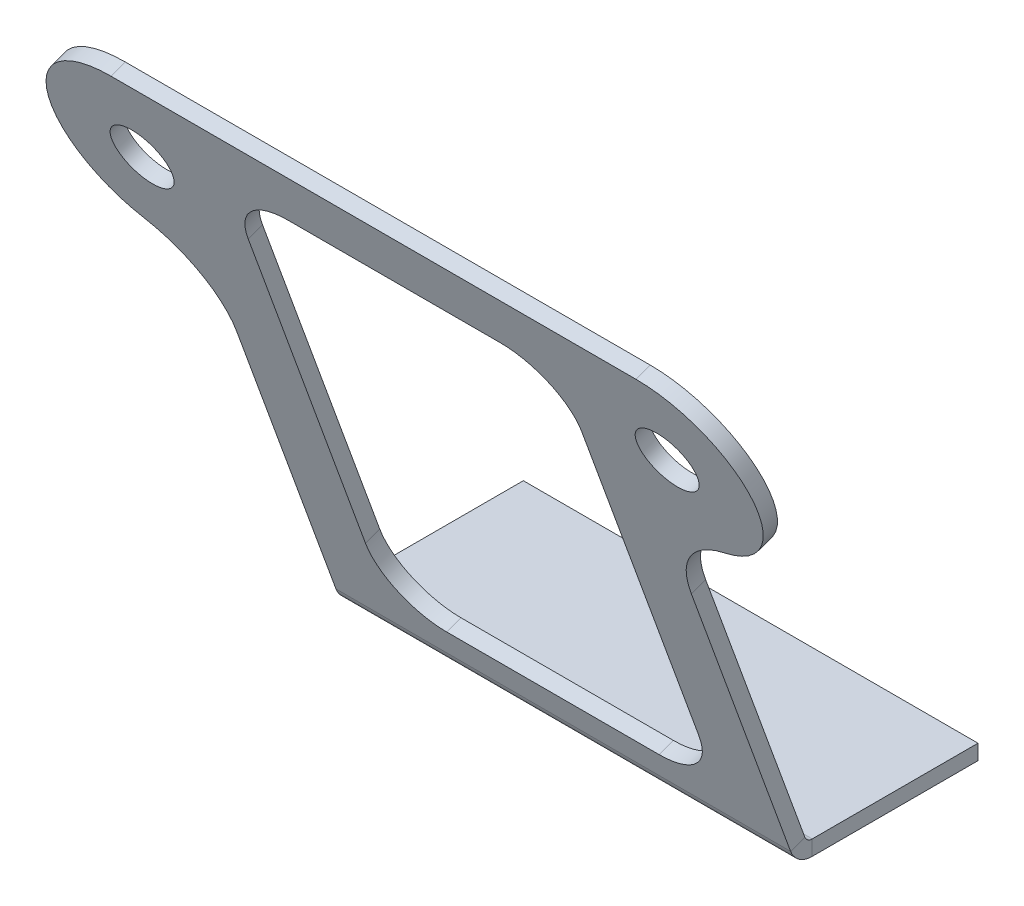
ISO-10303-21;
HEADER;
FILE_DESCRIPTION(('STEP AP214'),'2;1');
FILE_NAME('part.step','',(''),(''),'','','');
FILE_SCHEMA(('AUTOMOTIVE_DESIGN { 1 0 10303 214 1 1 1 1 }'));
ENDSEC;
DATA;
#1=APPLICATION_CONTEXT('core data for automotive mechanical design processes');
#2=APPLICATION_PROTOCOL_DEFINITION('international standard','automotive_design',2000,#1);
#3=PRODUCT_CONTEXT('',#1,'mechanical');
#4=PRODUCT('Part','Part','',(#3));
#5=PRODUCT_RELATED_PRODUCT_CATEGORY('part','',(#4));
#6=PRODUCT_DEFINITION_FORMATION('','',#4);
#7=PRODUCT_DEFINITION_CONTEXT('part definition',#1,'design');
#8=PRODUCT_DEFINITION('design','',#6,#7);
#9=PRODUCT_DEFINITION_SHAPE('','',#8);
#10=(LENGTH_UNIT() NAMED_UNIT(*) SI_UNIT(.MILLI.,.METRE.));
#11=(NAMED_UNIT(*) PLANE_ANGLE_UNIT() SI_UNIT($,.RADIAN.));
#12=(NAMED_UNIT(*) SI_UNIT($,.STERADIAN.) SOLID_ANGLE_UNIT());
#13=UNCERTAINTY_MEASURE_WITH_UNIT(LENGTH_MEASURE(1.E-05),#10,'distance_accuracy_value','');
#14=(GEOMETRIC_REPRESENTATION_CONTEXT(3) GLOBAL_UNCERTAINTY_ASSIGNED_CONTEXT((#13)) GLOBAL_UNIT_ASSIGNED_CONTEXT((#10,
#11,#12)) REPRESENTATION_CONTEXT('',''));
#15=CARTESIAN_POINT('',(0.,0.,0.));
#16=DIRECTION('',(0.,0.,1.));
#17=DIRECTION('',(1.,0.,0.));
#18=AXIS2_PLACEMENT_3D('',#15,#16,#17);
#19=CARTESIAN_POINT('',(-23.8125000000001,409.143751978719,-739.195534761065));
#20=DIRECTION('',(1.,0.,0.));
#21=DIRECTION('',(0.,0.,-1.));
#22=AXIS2_PLACEMENT_3D('',#19,#20,#21);
#23=PLANE('',#22);
#24=DIRECTION('',(0.,-0.342020143325631,0.939692620785922));
#25=VECTOR('',#24,1.);
#26=CARTESIAN_POINT('',(-23.8125000000001,381.11674274694,-751.085914090742));
#27=LINE('',#26,#25);
#28=CARTESIAN_POINT('',(-23.8125000000001,381.11674274694,-751.085914090742));
#29=VERTEX_POINT('',#28);
#30=CARTESIAN_POINT('',(-23.8125000000001,380.573785769411,-749.594152055245));
#31=VERTEX_POINT('',#30);
#32=EDGE_CURVE('E318',#29,#31,#27,.T.);
#33=ORIENTED_EDGE('',*,*,#32,.T.);
#34=DIRECTION('',(0.,-0.939692620785907,-0.342020143325671));
#35=VECTOR('',#34,1.);
#36=CARTESIAN_POINT('',(-23.8125000000001,409.143751978719,-739.195534761065));
#37=LINE('',#36,#35);
#38=CARTESIAN_POINT('',(-23.8125000000001,409.143751978719,-739.195534761065));
#39=VERTEX_POINT('',#38);
#40=EDGE_CURVE('E345',#39,#31,#37,.T.);
#41=ORIENTED_EDGE('',*,*,#40,.F.);
#42=DIRECTION('',(0.,0.34202014332567,-0.939692620785908));
#43=VECTOR('',#42,1.);
#44=CARTESIAN_POINT('',(-23.8125000000001,409.143751978719,-739.195534761065));
#45=LINE('',#44,#43);
#46=CARTESIAN_POINT('',(-23.8125000000001,409.686708956249,-740.687296796562));
#47=VERTEX_POINT('',#46);
#48=EDGE_CURVE('E371',#39,#47,#45,.T.);
#49=ORIENTED_EDGE('',*,*,#48,.T.);
#50=DIRECTION('',(0.,-0.939692620785907,-0.342020143325671));
#51=VECTOR('',#50,1.);
#52=CARTESIAN_POINT('',(-23.8125000000001,409.686708956249,-740.687296796562));
#53=LINE('',#52,#51);
#54=EDGE_CURVE('E360',#47,#29,#53,.T.);
#55=ORIENTED_EDGE('',*,*,#54,.T.);
#56=EDGE_LOOP('',(#33,#41,#49,#55));
#57=FACE_BOUND('',#56,.T.);
#58=ADVANCED_FACE('F62',(#57),#23,.F.);
#59=CARTESIAN_POINT('',(23.8124999999999,409.143751978719,-739.195534761065));
#60=DIRECTION('',(-1.,0.,0.));
#61=DIRECTION('',(0.,-1.,0.));
#62=AXIS2_PLACEMENT_3D('',#59,#60,#61);
#63=PLANE('',#62);
#64=DIRECTION('',(0.,-0.342020143325631,0.939692620785922));
#65=VECTOR('',#64,1.);
#66=CARTESIAN_POINT('',(23.8124999999999,381.11674274694,-751.085914090742));
#67=LINE('',#66,#65);
#68=CARTESIAN_POINT('',(23.8124999999999,381.11674274694,-751.085914090742));
#69=VERTEX_POINT('',#68);
#70=CARTESIAN_POINT('',(23.8124999999999,380.573785769411,-749.594152055244));
#71=VERTEX_POINT('',#70);
#72=EDGE_CURVE('E329',#69,#71,#67,.T.);
#73=ORIENTED_EDGE('',*,*,#72,.F.);
#74=DIRECTION('',(0.,0.939692620785907,0.342020143325671));
#75=VECTOR('',#74,1.);
#76=CARTESIAN_POINT('',(23.8124999999999,409.686708956249,-740.687296796562));
#77=LINE('',#76,#75);
#78=CARTESIAN_POINT('',(23.8124999999999,409.686708956249,-740.687296796562));
#79=VERTEX_POINT('',#78);
#80=EDGE_CURVE('E363',#69,#79,#77,.T.);
#81=ORIENTED_EDGE('',*,*,#80,.T.);
#82=DIRECTION('',(0.,0.34202014332567,-0.939692620785908));
#83=VECTOR('',#82,1.);
#84=CARTESIAN_POINT('',(23.8124999999999,409.143751978719,-739.195534761065));
#85=LINE('',#84,#83);
#86=CARTESIAN_POINT('',(23.8124999999999,409.143751978719,-739.195534761065));
#87=VERTEX_POINT('',#86);
#88=EDGE_CURVE('E368',#87,#79,#85,.T.);
#89=ORIENTED_EDGE('',*,*,#88,.F.);
#90=DIRECTION('',(0.,0.939692620785907,0.342020143325671));
#91=VECTOR('',#90,1.);
#92=CARTESIAN_POINT('',(23.8124999999999,409.143751978719,-739.195534761065));
#93=LINE('',#92,#91);
#94=EDGE_CURVE('E347',#71,#87,#93,.T.);
#95=ORIENTED_EDGE('',*,*,#94,.F.);
#96=EDGE_LOOP('',(#73,#81,#89,#95));
#97=FACE_BOUND('',#96,.T.);
#98=ADVANCED_FACE('F411',(#97),#63,.F.);
#99=CARTESIAN_POINT('',(27.5,426.233657322688,-732.975317909433));
#100=DIRECTION('',(0.,0.34202014332567,-0.939692620785908));
#101=DIRECTION('',(0.,0.939692620785908,0.34202014332567));
#102=AXIS2_PLACEMENT_3D('',#99,#100,#101);
#103=PLANE('',#102);
#104=DIRECTION('',(0.,-0.939692620785909,-0.342020143325668));
#105=VECTOR('',#104,1.);
#106=CARTESIAN_POINT('',(17.4624999999999,423.250133251693,-734.061231864493));
#107=LINE('',#106,#105);
#108=CARTESIAN_POINT('',(17.4624999999999,423.250133251693,-734.061231864493));
#109=VERTEX_POINT('',#108);
#110=CARTESIAN_POINT('',(17.4624999999999,389.524357982397,-746.336410190068));
#111=VERTEX_POINT('',#110);
#112=EDGE_CURVE('E207',#109,#111,#107,.T.);
#113=ORIENTED_EDGE('',*,*,#112,.T.);
#114=CARTESIAN_POINT('',(11.1124999999999,389.524357982397,-746.336410190068));
#115=DIRECTION('',(0.,0.34202014332567,-0.939692620785908));
#116=DIRECTION('',(0.,0.939692620785908,0.34202014332567));
#117=AXIS2_PLACEMENT_3D('',#114,#115,#116);
#118=CIRCLE('',#117,6.35);
#119=CARTESIAN_POINT('',(11.1124999999999,383.557309840406,-748.508238100186));
#120=VERTEX_POINT('',#119);
#121=EDGE_CURVE('E201',#111,#120,#118,.T.);
#122=ORIENTED_EDGE('',*,*,#121,.T.);
#123=DIRECTION('',(-1.,0.,0.));
#124=VECTOR('',#123,1.);
#125=CARTESIAN_POINT('',(11.1124999999999,383.557309840406,-748.508238100186));
#126=LINE('',#125,#124);
#127=CARTESIAN_POINT('',(-11.1125000000001,383.557309840406,-748.508238100185));
#128=VERTEX_POINT('',#127);
#129=EDGE_CURVE('E210',#120,#128,#126,.T.);
#130=ORIENTED_EDGE('',*,*,#129,.T.);
#131=CARTESIAN_POINT('',(-11.1125000000001,389.524357982397,-746.336410190068));
#132=DIRECTION('',(0.,0.34202014332567,-0.939692620785908));
#133=DIRECTION('',(0.,0.939692620785908,0.34202014332567));
#134=AXIS2_PLACEMENT_3D('',#131,#132,#133);
#135=CIRCLE('',#134,6.35);
#136=CARTESIAN_POINT('',(-17.4625000000001,389.524357982397,-746.336410190068));
#137=VERTEX_POINT('',#136);
#138=EDGE_CURVE('E77',#128,#137,#135,.T.);
#139=ORIENTED_EDGE('',*,*,#138,.T.);
#140=DIRECTION('',(0.,0.939692620785909,0.342020143325668));
#141=VECTOR('',#140,1.);
#142=CARTESIAN_POINT('',(-17.4625000000001,423.250133251693,-734.061231864493));
#143=LINE('',#142,#141);
#144=CARTESIAN_POINT('',(-17.4625000000001,423.250133251693,-734.061231864493));
#145=VERTEX_POINT('',#144);
#146=EDGE_CURVE('E225',#137,#145,#143,.T.);
#147=ORIENTED_EDGE('',*,*,#146,.T.);
#148=CARTESIAN_POINT('',(-11.1125000000001,423.250133251693,-734.061231864493));
#149=DIRECTION('',(0.,0.34202014332567,-0.939692620785908));
#150=DIRECTION('',(0.,-0.939692620785908,-0.34202014332567));
#151=AXIS2_PLACEMENT_3D('',#148,#149,#150);
#152=CIRCLE('',#151,6.34999999999998);
#153=CARTESIAN_POINT('',(-11.1125,429.217181393684,-731.889403954375));
#154=VERTEX_POINT('',#153);
#155=EDGE_CURVE('E228',#145,#154,#152,.T.);
#156=ORIENTED_EDGE('',*,*,#155,.T.);
#157=DIRECTION('',(1.,0.,0.));
#158=VECTOR('',#157,1.);
#159=CARTESIAN_POINT('',(11.1124999999999,429.217181393684,-731.889403954375));
#160=LINE('',#159,#158);
#161=CARTESIAN_POINT('',(11.1124999999999,429.217181393684,-731.889403954375));
#162=VERTEX_POINT('',#161);
#163=EDGE_CURVE('E231',#154,#162,#160,.T.);
#164=ORIENTED_EDGE('',*,*,#163,.T.);
#165=CARTESIAN_POINT('',(11.1124999999999,423.250133251693,-734.061231864493));
#166=DIRECTION('',(0.,0.34202014332567,-0.939692620785908));
#167=DIRECTION('',(0.,0.939692620785908,0.34202014332567));
#168=AXIS2_PLACEMENT_3D('',#165,#166,#167);
#169=CIRCLE('',#168,6.34999999999998);
#170=EDGE_CURVE('E234',#162,#109,#169,.T.);
#171=ORIENTED_EDGE('',*,*,#170,.T.);
#172=EDGE_LOOP('',(#113,#122,#130,#139,#147,#156,#164,#171));
#173=FACE_BOUND('',#172,.T.);
#174=CARTESIAN_POINT('',(-27.5,426.233657322688,-732.975317909434));
#175=DIRECTION('',(0.,-0.34202014332567,0.939692620785908));
#176=DIRECTION('',(0.,-0.939692620785908,-0.34202014332567));
#177=AXIS2_PLACEMENT_3D('',#174,#175,#176);
#178=CIRCLE('',#177,3.175);
#179=CARTESIAN_POINT('',(-27.5,423.250133251693,-734.061231864493));
#180=VERTEX_POINT('',#179);
#181=EDGE_CURVE('E272',#180,#180,#178,.T.);
#182=ORIENTED_EDGE('',*,*,#181,.F.);
#183=EDGE_LOOP('',(#182));
#184=FACE_BOUND('',#183,.T.);
#185=CARTESIAN_POINT('',(27.5,426.233657322688,-732.975317909434));
#186=DIRECTION('',(0.,-0.34202014332567,0.939692620785908));
#187=DIRECTION('',(0.,-0.939692620785908,-0.34202014332567));
#188=AXIS2_PLACEMENT_3D('',#185,#186,#187);
#189=CIRCLE('',#188,3.175);
#190=CARTESIAN_POINT('',(27.5,423.250133251693,-734.061231864493));
#191=VERTEX_POINT('',#190);
#192=EDGE_CURVE('E275',#191,#191,#189,.T.);
#193=ORIENTED_EDGE('',*,*,#192,.F.);
#194=EDGE_LOOP('',(#193));
#195=FACE_BOUND('',#194,.T.);
#196=DIRECTION('',(-1.,0.,0.));
#197=VECTOR('',#196,1.);
#198=CARTESIAN_POINT('',(-23.8125000000001,380.573785769411,-749.594152055245));
#199=LINE('',#198,#197);
#200=EDGE_CURVE('E312',#31,#71,#199,.F.);
#201=ORIENTED_EDGE('',*,*,#200,.T.);
#202=ORIENTED_EDGE('',*,*,#94,.T.);
#203=CARTESIAN_POINT('',(33.4105319242057,409.143751978719,-739.195534761065));
#204=DIRECTION('',(0.,0.34202014332567,-0.939692620785908));
#205=DIRECTION('',(0.,-0.939692620785908,-0.34202014332567));
#206=AXIS2_PLACEMENT_3D('',#203,#204,#205);
#207=CIRCLE('',#206,9.59803192420575);
#208=CARTESIAN_POINT('',(30.4439796367645,417.721338300972,-736.073548657916));
#209=VERTEX_POINT('',#208);
#210=EDGE_CURVE('E349',#87,#209,#207,.T.);
#211=ORIENTED_EDGE('',*,*,#210,.T.);
#212=CARTESIAN_POINT('',(27.5,426.233657322688,-732.975317909433));
#213=DIRECTION('',(0.,-0.34202014332567,0.939692620785908));
#214=DIRECTION('',(0.,0.939692620785908,0.34202014332567));
#215=AXIS2_PLACEMENT_3D('',#212,#213,#214);
#216=CIRCLE('',#215,9.525);
#217=CARTESIAN_POINT('',(27.5,435.184229535674,-729.717576044256));
#218=VERTEX_POINT('',#217);
#219=EDGE_CURVE('E335',#209,#218,#216,.T.);
#220=ORIENTED_EDGE('',*,*,#219,.T.);
#221=DIRECTION('',(-1.,0.,0.));
#222=VECTOR('',#221,1.);
#223=CARTESIAN_POINT('',(-27.5000000000002,435.184229535674,-729.717576044256));
#224=LINE('',#223,#222);
#225=CARTESIAN_POINT('',(-27.5000000000002,435.184229535674,-729.717576044256));
#226=VERTEX_POINT('',#225);
#227=EDGE_CURVE('E338',#218,#226,#224,.T.);
#228=ORIENTED_EDGE('',*,*,#227,.T.);
#229=CARTESIAN_POINT('',(-27.5000000000002,426.233657322688,-732.975317909433));
#230=DIRECTION('',(0.,-0.34202014332567,0.939692620785908));
#231=DIRECTION('',(0.,-0.939692620785908,-0.34202014332567));
#232=AXIS2_PLACEMENT_3D('',#229,#230,#231);
#233=CIRCLE('',#232,9.525);
#234=CARTESIAN_POINT('',(-30.4439796367647,417.721338300972,-736.073548657916));
#235=VERTEX_POINT('',#234);
#236=EDGE_CURVE('E341',#226,#235,#233,.T.);
#237=ORIENTED_EDGE('',*,*,#236,.T.);
#238=CARTESIAN_POINT('',(-33.4105319242058,409.143751978719,-739.195534761065));
#239=DIRECTION('',(0.,0.34202014332567,-0.939692620785908));
#240=DIRECTION('',(0.,0.939692620785908,0.34202014332567));
#241=AXIS2_PLACEMENT_3D('',#238,#239,#240);
#242=CIRCLE('',#241,9.59803192420575);
#243=EDGE_CURVE('E343',#235,#39,#242,.T.);
#244=ORIENTED_EDGE('',*,*,#243,.T.);
#245=ORIENTED_EDGE('',*,*,#40,.T.);
#246=EDGE_LOOP('',(#201,#202,#211,#220,#228,#237,#244,#245));
#247=FACE_BOUND('',#246,.T.);
#248=ADVANCED_FACE('F214',(#173,#184,#195,#247),#103,.F.);
#249=CARTESIAN_POINT('',(27.5,426.776614300218,-734.467079944931));
#250=DIRECTION('',(0.,0.34202014332567,-0.939692620785908));
#251=DIRECTION('',(0.,0.939692620785908,0.34202014332567));
#252=AXIS2_PLACEMENT_3D('',#249,#250,#251);
#253=PLANE('',#252);
#254=CARTESIAN_POINT('',(11.1124999999999,390.067314959926,-747.828172225565));
#255=DIRECTION('',(0.,0.34202014332567,-0.939692620785908));
#256=DIRECTION('',(0.,0.939692620785908,0.34202014332567));
#257=AXIS2_PLACEMENT_3D('',#254,#255,#256);
#258=CIRCLE('',#257,6.35);
#259=CARTESIAN_POINT('',(17.4624999999999,390.067314959926,-747.828172225565));
#260=VERTEX_POINT('',#259);
#261=CARTESIAN_POINT('',(11.1124999999999,384.100266817935,-750.000000135683));
#262=VERTEX_POINT('',#261);
#263=EDGE_CURVE('E85',#260,#262,#258,.T.);
#264=ORIENTED_EDGE('',*,*,#263,.F.);
#265=DIRECTION('',(0.,-0.939692620785909,-0.342020143325668));
#266=VECTOR('',#265,1.);
#267=CARTESIAN_POINT('',(17.4624999999999,423.793090229223,-735.55299389999));
#268=LINE('',#267,#266);
#269=CARTESIAN_POINT('',(17.4624999999999,423.793090229223,-735.55299389999));
#270=VERTEX_POINT('',#269);
#271=EDGE_CURVE('E218',#270,#260,#268,.T.);
#272=ORIENTED_EDGE('',*,*,#271,.F.);
#273=CARTESIAN_POINT('',(11.1124999999999,423.793090229223,-735.55299389999));
#274=DIRECTION('',(0.,0.34202014332567,-0.939692620785908));
#275=DIRECTION('',(0.,0.939692620785908,0.34202014332567));
#276=AXIS2_PLACEMENT_3D('',#273,#274,#275);
#277=CIRCLE('',#276,6.34999999999998);
#278=CARTESIAN_POINT('',(11.1124999999999,429.760138371213,-733.381165989872));
#279=VERTEX_POINT('',#278);
#280=EDGE_CURVE('E221',#279,#270,#277,.T.);
#281=ORIENTED_EDGE('',*,*,#280,.F.);
#282=DIRECTION('',(1.,0.,0.));
#283=VECTOR('',#282,1.);
#284=CARTESIAN_POINT('',(11.1124999999999,429.760138371213,-733.381165989872));
#285=LINE('',#284,#283);
#286=CARTESIAN_POINT('',(-11.1125,429.760138371213,-733.381165989872));
#287=VERTEX_POINT('',#286);
#288=EDGE_CURVE('E249',#287,#279,#285,.T.);
#289=ORIENTED_EDGE('',*,*,#288,.F.);
#290=CARTESIAN_POINT('',(-11.1125000000001,423.793090229223,-735.55299389999));
#291=DIRECTION('',(0.,0.34202014332567,-0.939692620785908));
#292=DIRECTION('',(0.,-0.939692620785908,-0.34202014332567));
#293=AXIS2_PLACEMENT_3D('',#290,#291,#292);
#294=CIRCLE('',#293,6.34999999999998);
#295=CARTESIAN_POINT('',(-17.4625000000001,423.793090229223,-735.55299389999));
#296=VERTEX_POINT('',#295);
#297=EDGE_CURVE('E246',#296,#287,#294,.T.);
#298=ORIENTED_EDGE('',*,*,#297,.F.);
#299=DIRECTION('',(0.,0.939692620785909,0.342020143325668));
#300=VECTOR('',#299,1.);
#301=CARTESIAN_POINT('',(-17.4625000000001,423.793090229223,-735.55299389999));
#302=LINE('',#301,#300);
#303=CARTESIAN_POINT('',(-17.4625000000001,390.067314959926,-747.828172225565));
#304=VERTEX_POINT('',#303);
#305=EDGE_CURVE('E243',#304,#296,#302,.T.);
#306=ORIENTED_EDGE('',*,*,#305,.F.);
#307=CARTESIAN_POINT('',(-11.1125000000001,390.067314959926,-747.828172225565));
#308=DIRECTION('',(0.,0.34202014332567,-0.939692620785908));
#309=DIRECTION('',(0.,0.939692620785908,0.34202014332567));
#310=AXIS2_PLACEMENT_3D('',#307,#308,#309);
#311=CIRCLE('',#310,6.35);
#312=CARTESIAN_POINT('',(-11.1125000000001,384.100266817936,-750.000000135683));
#313=VERTEX_POINT('',#312);
#314=EDGE_CURVE('E240',#313,#304,#311,.T.);
#315=ORIENTED_EDGE('',*,*,#314,.F.);
#316=DIRECTION('',(-1.,0.,0.));
#317=VECTOR('',#316,1.);
#318=CARTESIAN_POINT('',(11.1124999999999,384.100266817936,-750.000000135683));
#319=LINE('',#318,#317);
#320=EDGE_CURVE('E238',#262,#313,#319,.T.);
#321=ORIENTED_EDGE('',*,*,#320,.F.);
#322=EDGE_LOOP('',(#264,#272,#281,#289,#298,#306,#315,#321));
#323=FACE_BOUND('',#322,.T.);
#324=CARTESIAN_POINT('',(-27.5,426.776614300218,-734.467079944931));
#325=DIRECTION('',(0.,-0.34202014332567,0.939692620785908));
#326=DIRECTION('',(0.,-0.939692620785908,-0.34202014332567));
#327=AXIS2_PLACEMENT_3D('',#324,#325,#326);
#328=CIRCLE('',#327,3.175);
#329=CARTESIAN_POINT('',(-27.5,423.793090229223,-735.55299389999));
#330=VERTEX_POINT('',#329);
#331=EDGE_CURVE('E268',#330,#330,#328,.T.);
#332=ORIENTED_EDGE('',*,*,#331,.T.);
#333=EDGE_LOOP('',(#332));
#334=FACE_BOUND('',#333,.T.);
#335=CARTESIAN_POINT('',(27.5,426.776614300218,-734.467079944931));
#336=DIRECTION('',(0.,-0.34202014332567,0.939692620785908));
#337=DIRECTION('',(0.,-0.939692620785908,-0.34202014332567));
#338=AXIS2_PLACEMENT_3D('',#335,#336,#337);
#339=CIRCLE('',#338,3.175);
#340=CARTESIAN_POINT('',(27.5,423.793090229223,-735.55299389999));
#341=VERTEX_POINT('',#340);
#342=EDGE_CURVE('E256',#341,#341,#339,.T.);
#343=ORIENTED_EDGE('',*,*,#342,.T.);
#344=EDGE_LOOP('',(#343));
#345=FACE_BOUND('',#344,.T.);
#346=ORIENTED_EDGE('',*,*,#80,.F.);
#347=DIRECTION('',(-1.,0.,0.));
#348=VECTOR('',#347,1.);
#349=CARTESIAN_POINT('',(-23.8125000000001,381.11674274694,-751.085914090742));
#350=LINE('',#349,#348);
#351=EDGE_CURVE('E324',#29,#69,#350,.F.);
#352=ORIENTED_EDGE('',*,*,#351,.F.);
#353=ORIENTED_EDGE('',*,*,#54,.F.);
#354=CARTESIAN_POINT('',(-33.4105319242058,409.686708956249,-740.687296796562));
#355=DIRECTION('',(0.,0.34202014332567,-0.939692620785908));
#356=DIRECTION('',(0.,0.939692620785908,0.34202014332567));
#357=AXIS2_PLACEMENT_3D('',#354,#355,#356);
#358=CIRCLE('',#357,9.59803192420575);
#359=CARTESIAN_POINT('',(-30.4439796367647,418.264295278501,-737.565310693413));
#360=VERTEX_POINT('',#359);
#361=EDGE_CURVE('E358',#360,#47,#358,.T.);
#362=ORIENTED_EDGE('',*,*,#361,.F.);
#363=CARTESIAN_POINT('',(-27.5000000000002,426.776614300218,-734.467079944931));
#364=DIRECTION('',(0.,-0.34202014332567,0.939692620785908));
#365=DIRECTION('',(0.,-0.939692620785908,-0.34202014332567));
#366=AXIS2_PLACEMENT_3D('',#363,#364,#365);
#367=CIRCLE('',#366,9.525);
#368=CARTESIAN_POINT('',(-27.5000000000002,435.727186513204,-731.209338079754));
#369=VERTEX_POINT('',#368);
#370=EDGE_CURVE('E356',#369,#360,#367,.T.);
#371=ORIENTED_EDGE('',*,*,#370,.F.);
#372=DIRECTION('',(-1.,0.,0.));
#373=VECTOR('',#372,1.);
#374=CARTESIAN_POINT('',(-27.5000000000002,435.727186513204,-731.209338079754));
#375=LINE('',#374,#373);
#376=CARTESIAN_POINT('',(27.5,435.727186513204,-731.209338079754));
#377=VERTEX_POINT('',#376);
#378=EDGE_CURVE('E354',#377,#369,#375,.T.);
#379=ORIENTED_EDGE('',*,*,#378,.F.);
#380=CARTESIAN_POINT('',(27.5,426.776614300218,-734.467079944931));
#381=DIRECTION('',(0.,-0.34202014332567,0.939692620785908));
#382=DIRECTION('',(0.,0.939692620785908,0.34202014332567));
#383=AXIS2_PLACEMENT_3D('',#380,#381,#382);
#384=CIRCLE('',#383,9.525);
#385=CARTESIAN_POINT('',(30.4439796367645,418.264295278501,-737.565310693413));
#386=VERTEX_POINT('',#385);
#387=EDGE_CURVE('E332',#386,#377,#384,.T.);
#388=ORIENTED_EDGE('',*,*,#387,.F.);
#389=CARTESIAN_POINT('',(33.4105319242057,409.686708956249,-740.687296796562));
#390=DIRECTION('',(0.,0.34202014332567,-0.939692620785908));
#391=DIRECTION('',(0.,-0.939692620785908,-0.34202014332567));
#392=AXIS2_PLACEMENT_3D('',#389,#390,#391);
#393=CIRCLE('',#392,9.59803192420575);
#394=EDGE_CURVE('E339',#79,#386,#393,.T.);
#395=ORIENTED_EDGE('',*,*,#394,.F.);
#396=EDGE_LOOP('',(#346,#352,#353,#362,#371,#379,#388,#395));
#397=FACE_BOUND('',#396,.T.);
#398=ADVANCED_FACE('F387',(#323,#334,#345,#397),#253,.T.);
#399=CARTESIAN_POINT('',(27.5,426.233657322688,-732.975317909433));
#400=DIRECTION('',(0.,0.34202014332567,-0.939692620785908));
#401=DIRECTION('',(0.,0.939692620785908,0.34202014332567));
#402=AXIS2_PLACEMENT_3D('',#399,#400,#401);
#403=CYLINDRICAL_SURFACE('',#402,9.525);
#404=ORIENTED_EDGE('',*,*,#387,.T.);
#405=DIRECTION('',(0.,0.34202014332567,-0.939692620785908));
#406=VECTOR('',#405,1.);
#407=CARTESIAN_POINT('',(27.5,435.184229535674,-729.717576044256));
#408=LINE('',#407,#406);
#409=EDGE_CURVE('E13',#218,#377,#408,.T.);
#410=ORIENTED_EDGE('',*,*,#409,.F.);
#411=ORIENTED_EDGE('',*,*,#219,.F.);
#412=DIRECTION('',(0.,0.34202014332567,-0.939692620785908));
#413=VECTOR('',#412,1.);
#414=CARTESIAN_POINT('',(30.4439796367645,417.721338300972,-736.073548657916));
#415=LINE('',#414,#413);
#416=EDGE_CURVE('E351',#209,#386,#415,.T.);
#417=ORIENTED_EDGE('',*,*,#416,.T.);
#418=EDGE_LOOP('',(#404,#410,#411,#417));
#419=FACE_BOUND('',#418,.T.);
#420=ADVANCED_FACE('F64',(#419),#403,.T.);
#421=CARTESIAN_POINT('',(-27.5000000000002,435.184229535674,-729.717576044256));
#422=DIRECTION('',(0.,-0.939692620785908,-0.34202014332567));
#423=DIRECTION('',(0.,0.34202014332567,-0.939692620785908));
#424=AXIS2_PLACEMENT_3D('',#421,#422,#423);
#425=PLANE('',#424);
#426=ORIENTED_EDGE('',*,*,#378,.T.);
#427=DIRECTION('',(0.,0.34202014332567,-0.939692620785908));
#428=VECTOR('',#427,1.);
#429=CARTESIAN_POINT('',(-27.5000000000002,435.184229535674,-729.717576044256));
#430=LINE('',#429,#428);
#431=EDGE_CURVE('E70',#226,#369,#430,.T.);
#432=ORIENTED_EDGE('',*,*,#431,.F.);
#433=ORIENTED_EDGE('',*,*,#227,.F.);
#434=ORIENTED_EDGE('',*,*,#409,.T.);
#435=EDGE_LOOP('',(#426,#432,#433,#434));
#436=FACE_BOUND('',#435,.T.);
#437=ADVANCED_FACE('F402',(#436),#425,.F.);
#438=CARTESIAN_POINT('',(-27.5000000000002,426.233657322688,-732.975317909433));
#439=DIRECTION('',(0.,0.34202014332567,-0.939692620785908));
#440=DIRECTION('',(0.,0.939692620785908,0.34202014332567));
#441=AXIS2_PLACEMENT_3D('',#438,#439,#440);
#442=CYLINDRICAL_SURFACE('',#441,9.525);
#443=ORIENTED_EDGE('',*,*,#370,.T.);
#444=DIRECTION('',(0.,0.34202014332567,-0.939692620785908));
#445=VECTOR('',#444,1.);
#446=CARTESIAN_POINT('',(-30.4439796367647,417.721338300972,-736.073548657916));
#447=LINE('',#446,#445);
#448=EDGE_CURVE('E374',#235,#360,#447,.T.);
#449=ORIENTED_EDGE('',*,*,#448,.F.);
#450=ORIENTED_EDGE('',*,*,#236,.F.);
#451=ORIENTED_EDGE('',*,*,#431,.T.);
#452=EDGE_LOOP('',(#443,#449,#450,#451));
#453=FACE_BOUND('',#452,.T.);
#454=ADVANCED_FACE('F381',(#453),#442,.T.);
#455=CARTESIAN_POINT('',(-33.4105319242058,409.143751978719,-739.195534761065));
#456=DIRECTION('',(0.,0.34202014332567,-0.939692620785908));
#457=DIRECTION('',(0.,0.939692620785908,0.34202014332567));
#458=AXIS2_PLACEMENT_3D('',#455,#456,#457);
#459=CYLINDRICAL_SURFACE('',#458,9.59803192420575);
#460=ORIENTED_EDGE('',*,*,#361,.T.);
#461=ORIENTED_EDGE('',*,*,#48,.F.);
#462=ORIENTED_EDGE('',*,*,#243,.F.);
#463=ORIENTED_EDGE('',*,*,#448,.T.);
#464=EDGE_LOOP('',(#460,#461,#462,#463));
#465=FACE_BOUND('',#464,.T.);
#466=ADVANCED_FACE('F392',(#465),#459,.F.);
#467=CARTESIAN_POINT('',(33.4105319242057,409.143751978719,-739.195534761065));
#468=DIRECTION('',(0.,0.34202014332567,-0.939692620785908));
#469=DIRECTION('',(0.,0.939692620785908,0.34202014332567));
#470=AXIS2_PLACEMENT_3D('',#467,#468,#469);
#471=CYLINDRICAL_SURFACE('',#470,9.59803192420575);
#472=ORIENTED_EDGE('',*,*,#394,.T.);
#473=ORIENTED_EDGE('',*,*,#416,.F.);
#474=ORIENTED_EDGE('',*,*,#210,.F.);
#475=ORIENTED_EDGE('',*,*,#88,.T.);
#476=EDGE_LOOP('',(#472,#473,#474,#475));
#477=FACE_BOUND('',#476,.T.);
#478=ADVANCED_FACE('F407',(#477),#471,.F.);
#479=CARTESIAN_POINT('',(23.8124999999999,381.394736719435,-751.849696252917));
#480=DIRECTION('',(1.,0.,0.));
#481=DIRECTION('',(0.,0.,-1.));
#482=AXIS2_PLACEMENT_3D('',#479,#480,#481);
#483=PLANE('',#482);
#484=DIRECTION('',(0.,-1.,0.));
#485=VECTOR('',#484,1.);
#486=CARTESIAN_POINT('',(23.8124999999999,378.994436719435,-751.849696252917));
#487=LINE('',#486,#485);
#488=CARTESIAN_POINT('',(23.8124999999999,380.581936719435,-751.849696252917));
#489=VERTEX_POINT('',#488);
#490=CARTESIAN_POINT('',(23.8124999999999,378.994436719435,-751.849696252917));
#491=VERTEX_POINT('',#490);
#492=EDGE_CURVE('E271',#489,#491,#487,.T.);
#493=ORIENTED_EDGE('',*,*,#492,.F.);
#494=CARTESIAN_POINT('',(23.8124999999999,381.394736719435,-751.849696252917));
#495=DIRECTION('',(-1.,0.,0.));
#496=DIRECTION('',(0.,0.,1.));
#497=AXIS2_PLACEMENT_3D('',#494,#495,#496);
#498=CIRCLE('',#497,0.812799999999947);
#499=EDGE_CURVE('E321',#69,#489,#498,.F.);
#500=ORIENTED_EDGE('',*,*,#499,.F.);
#501=ORIENTED_EDGE('',*,*,#72,.T.);
#502=CARTESIAN_POINT('',(23.8124999999999,381.394736719435,-751.849696252917));
#503=DIRECTION('',(-1.,0.,0.));
#504=DIRECTION('',(0.,0.,1.));
#505=AXIS2_PLACEMENT_3D('',#502,#503,#504);
#506=CIRCLE('',#505,2.40029999999995);
#507=EDGE_CURVE('E314',#71,#491,#506,.F.);
#508=ORIENTED_EDGE('',*,*,#507,.T.);
#509=EDGE_LOOP('',(#493,#500,#501,#508));
#510=FACE_BOUND('',#509,.T.);
#511=ADVANCED_FACE('F415',(#510),#483,.T.);
#512=CARTESIAN_POINT('',(-23.8125000000001,381.394736719435,-751.849696252917));
#513=DIRECTION('',(1.,0.,0.));
#514=DIRECTION('',(0.,0.,-1.));
#515=AXIS2_PLACEMENT_3D('',#512,#513,#514);
#516=PLANE('',#515);
#517=CARTESIAN_POINT('',(-23.8125000000001,381.394736719435,-751.849696252917));
#518=DIRECTION('',(-1.,0.,0.));
#519=DIRECTION('',(0.,0.,1.));
#520=AXIS2_PLACEMENT_3D('',#517,#518,#519);
#521=CIRCLE('',#520,0.812799999999947);
#522=CARTESIAN_POINT('',(-23.8125000000001,380.581936719435,-751.849696252917));
#523=VERTEX_POINT('',#522);
#524=EDGE_CURVE('E282',#523,#29,#521,.T.);
#525=ORIENTED_EDGE('',*,*,#524,.F.);
#526=DIRECTION('',(0.,-1.,0.));
#527=VECTOR('',#526,1.);
#528=CARTESIAN_POINT('',(-23.8125000000001,380.581936719435,-751.849696252917));
#529=LINE('',#528,#527);
#530=CARTESIAN_POINT('',(-23.8125000000001,378.994436719435,-751.849696252917));
#531=VERTEX_POINT('',#530);
#532=EDGE_CURVE('E305',#523,#531,#529,.T.);
#533=ORIENTED_EDGE('',*,*,#532,.T.);
#534=CARTESIAN_POINT('',(-23.8125000000001,381.394736719435,-751.849696252917));
#535=DIRECTION('',(-1.,0.,0.));
#536=DIRECTION('',(0.,0.,1.));
#537=AXIS2_PLACEMENT_3D('',#534,#535,#536);
#538=CIRCLE('',#537,2.40029999999995);
#539=EDGE_CURVE('E315',#531,#31,#538,.T.);
#540=ORIENTED_EDGE('',*,*,#539,.T.);
#541=ORIENTED_EDGE('',*,*,#32,.F.);
#542=EDGE_LOOP('',(#525,#533,#540,#541));
#543=FACE_BOUND('',#542,.T.);
#544=ADVANCED_FACE('F481',(#543),#516,.F.);
#545=CARTESIAN_POINT('',(-23.8125000000001,381.394736719435,-751.849696252917));
#546=DIRECTION('',(-1.,0.,0.));
#547=DIRECTION('',(0.,-1.,0.));
#548=AXIS2_PLACEMENT_3D('',#545,#546,#547);
#549=CYLINDRICAL_SURFACE('',#548,2.40029999999995);
#550=ORIENTED_EDGE('',*,*,#200,.F.);
#551=ORIENTED_EDGE('',*,*,#539,.F.);
#552=DIRECTION('',(-1.,0.,0.));
#553=VECTOR('',#552,1.);
#554=CARTESIAN_POINT('',(0.,378.994436719435,-751.849696252917));
#555=LINE('',#554,#553);
#556=EDGE_CURVE('E302',#491,#531,#555,.T.);
#557=ORIENTED_EDGE('',*,*,#556,.F.);
#558=ORIENTED_EDGE('',*,*,#507,.F.);
#559=EDGE_LOOP('',(#550,#551,#557,#558));
#560=FACE_BOUND('',#559,.T.);
#561=ADVANCED_FACE('F417',(#560),#549,.T.);
#562=CARTESIAN_POINT('',(-23.8125000000001,381.394736719435,-751.849696252917));
#563=DIRECTION('',(-1.,0.,0.));
#564=DIRECTION('',(0.,-1.,0.));
#565=AXIS2_PLACEMENT_3D('',#562,#563,#564);
#566=CYLINDRICAL_SURFACE('',#565,0.812799999999947);
#567=ORIENTED_EDGE('',*,*,#351,.T.);
#568=ORIENTED_EDGE('',*,*,#499,.T.);
#569=DIRECTION('',(1.,0.,0.));
#570=VECTOR('',#569,1.);
#571=CARTESIAN_POINT('',(23.8124999999999,380.581936719435,-751.849696252917));
#572=LINE('',#571,#570);
#573=EDGE_CURVE('E308',#489,#523,#572,.F.);
#574=ORIENTED_EDGE('',*,*,#573,.T.);
#575=ORIENTED_EDGE('',*,*,#524,.T.);
#576=EDGE_LOOP('',(#567,#568,#574,#575));
#577=FACE_BOUND('',#576,.T.);
#578=ADVANCED_FACE('F436',(#577),#566,.F.);
#579=CARTESIAN_POINT('',(-23.8125000000001,378.994436719435,-751.28056756586));
#580=DIRECTION('',(-1.,0.,0.));
#581=DIRECTION('',(0.,0.,1.));
#582=AXIS2_PLACEMENT_3D('',#579,#580,#581);
#583=PLANE('',#582);
#584=DIRECTION('',(0.,0.,1.));
#585=VECTOR('',#584,1.);
#586=CARTESIAN_POINT('',(-23.8125000000001,378.994436719435,-751.28056756586));
#587=LINE('',#586,#585);
#588=CARTESIAN_POINT('',(-23.8125000000001,378.994436719435,-769.218988098952));
#589=VERTEX_POINT('',#588);
#590=EDGE_CURVE('E286',#589,#531,#587,.T.);
#591=ORIENTED_EDGE('',*,*,#590,.T.);
#592=ORIENTED_EDGE('',*,*,#532,.F.);
#593=DIRECTION('',(0.,0.,-1.));
#594=VECTOR('',#593,1.);
#595=CARTESIAN_POINT('',(-23.8125000000001,380.581936719438,0.577802746896426));
#596=LINE('',#595,#594);
#597=CARTESIAN_POINT('',(-23.8125000000001,380.581936719435,-769.218988098952));
#598=VERTEX_POINT('',#597);
#599=EDGE_CURVE('E294',#598,#523,#596,.F.);
#600=ORIENTED_EDGE('',*,*,#599,.F.);
#601=DIRECTION('',(0.,1.,0.));
#602=VECTOR('',#601,1.);
#603=CARTESIAN_POINT('',(-23.8125000000001,378.994436719435,-769.218988098952));
#604=LINE('',#603,#602);
#605=EDGE_CURVE('E280',#589,#598,#604,.T.);
#606=ORIENTED_EDGE('',*,*,#605,.F.);
#607=EDGE_LOOP('',(#591,#592,#600,#606));
#608=FACE_BOUND('',#607,.T.);
#609=ADVANCED_FACE('F425',(#608),#583,.T.);
#610=CARTESIAN_POINT('',(23.8124999999999,378.994436719435,-769.218988098952));
#611=DIRECTION('',(1.,0.,0.));
#612=DIRECTION('',(0.,0.,-1.));
#613=AXIS2_PLACEMENT_3D('',#610,#611,#612);
#614=PLANE('',#613);
#615=DIRECTION('',(0.,0.,1.));
#616=VECTOR('',#615,1.);
#617=CARTESIAN_POINT('',(23.8124999999999,380.581936719438,0.577802746896426));
#618=LINE('',#617,#616);
#619=CARTESIAN_POINT('',(23.8124999999999,380.581936719435,-769.218988098952));
#620=VERTEX_POINT('',#619);
#621=EDGE_CURVE('E300',#489,#620,#618,.F.);
#622=ORIENTED_EDGE('',*,*,#621,.F.);
#623=ORIENTED_EDGE('',*,*,#492,.T.);
#624=DIRECTION('',(0.,0.,-1.));
#625=VECTOR('',#624,1.);
#626=CARTESIAN_POINT('',(23.8124999999999,378.994436719435,-769.218988098952));
#627=LINE('',#626,#625);
#628=CARTESIAN_POINT('',(23.8124999999999,378.994436719435,-769.218988098952));
#629=VERTEX_POINT('',#628);
#630=EDGE_CURVE('E292',#491,#629,#627,.T.);
#631=ORIENTED_EDGE('',*,*,#630,.T.);
#632=DIRECTION('',(0.,1.,0.));
#633=VECTOR('',#632,1.);
#634=CARTESIAN_POINT('',(23.8124999999999,378.994436719435,-769.218988098952));
#635=LINE('',#634,#633);
#636=EDGE_CURVE('E283',#629,#620,#635,.T.);
#637=ORIENTED_EDGE('',*,*,#636,.T.);
#638=EDGE_LOOP('',(#622,#623,#631,#637));
#639=FACE_BOUND('',#638,.T.);
#640=ADVANCED_FACE('F433',(#639),#614,.T.);
#641=CARTESIAN_POINT('',(0.,378.994436719438,0.577802746896431));
#642=DIRECTION('',(0.,-1.,0.));
#643=DIRECTION('',(0.,0.,-1.));
#644=AXIS2_PLACEMENT_3D('',#641,#642,#643);
#645=PLANE('',#644);
#646=ORIENTED_EDGE('',*,*,#630,.F.);
#647=ORIENTED_EDGE('',*,*,#556,.T.);
#648=ORIENTED_EDGE('',*,*,#590,.F.);
#649=DIRECTION('',(-1.,0.,0.));
#650=VECTOR('',#649,1.);
#651=CARTESIAN_POINT('',(-23.8125000000001,378.994436719435,-769.218988098952));
#652=LINE('',#651,#650);
#653=EDGE_CURVE('E289',#629,#589,#652,.T.);
#654=ORIENTED_EDGE('',*,*,#653,.F.);
#655=EDGE_LOOP('',(#646,#647,#648,#654));
#656=FACE_BOUND('',#655,.T.);
#657=ADVANCED_FACE('F421',(#656),#645,.T.);
#658=CARTESIAN_POINT('',(0.,380.581936719438,0.577802746896426));
#659=DIRECTION('',(0.,-1.,0.));
#660=DIRECTION('',(0.,0.,-1.));
#661=AXIS2_PLACEMENT_3D('',#658,#659,#660);
#662=PLANE('',#661);
#663=ORIENTED_EDGE('',*,*,#573,.F.);
#664=ORIENTED_EDGE('',*,*,#621,.T.);
#665=DIRECTION('',(1.,0.,0.));
#666=VECTOR('',#665,1.);
#667=CARTESIAN_POINT('',(0.,380.581936719435,-769.218988098952));
#668=LINE('',#667,#666);
#669=EDGE_CURVE('E297',#620,#598,#668,.F.);
#670=ORIENTED_EDGE('',*,*,#669,.T.);
#671=ORIENTED_EDGE('',*,*,#599,.T.);
#672=EDGE_LOOP('',(#663,#664,#670,#671));
#673=FACE_BOUND('',#672,.T.);
#674=ADVANCED_FACE('F439',(#673),#662,.F.);
#675=CARTESIAN_POINT('',(-23.8125000000001,378.994436719435,-769.218988098952));
#676=DIRECTION('',(0.,0.,-1.));
#677=DIRECTION('',(0.,1.,0.));
#678=AXIS2_PLACEMENT_3D('',#675,#676,#677);
#679=PLANE('',#678);
#680=ORIENTED_EDGE('',*,*,#669,.F.);
#681=ORIENTED_EDGE('',*,*,#636,.F.);
#682=ORIENTED_EDGE('',*,*,#653,.T.);
#683=ORIENTED_EDGE('',*,*,#605,.T.);
#684=EDGE_LOOP('',(#680,#681,#682,#683));
#685=FACE_BOUND('',#684,.T.);
#686=ADVANCED_FACE('F430',(#685),#679,.T.);
#687=CARTESIAN_POINT('',(27.5,426.776614300218,-734.467079944931));
#688=DIRECTION('',(0.,-0.34202014332567,0.939692620785908));
#689=DIRECTION('',(0.,-0.939692620785908,-0.34202014332567));
#690=AXIS2_PLACEMENT_3D('',#687,#688,#689);
#691=CYLINDRICAL_SURFACE('',#690,3.175);
#692=ORIENTED_EDGE('',*,*,#342,.F.);
#693=EDGE_LOOP('',(#692));
#694=FACE_BOUND('',#693,.T.);
#695=ORIENTED_EDGE('',*,*,#192,.T.);
#696=EDGE_LOOP('',(#695));
#697=FACE_BOUND('',#696,.T.);
#698=ADVANCED_FACE('F446',(#694,#697),#691,.F.);
#699=CARTESIAN_POINT('',(-27.5,426.776614300218,-734.467079944931));
#700=DIRECTION('',(0.,-0.34202014332567,0.939692620785908));
#701=DIRECTION('',(0.,-0.939692620785908,-0.34202014332567));
#702=AXIS2_PLACEMENT_3D('',#699,#700,#701);
#703=CYLINDRICAL_SURFACE('',#702,3.175);
#704=ORIENTED_EDGE('',*,*,#331,.F.);
#705=EDGE_LOOP('',(#704));
#706=FACE_BOUND('',#705,.T.);
#707=ORIENTED_EDGE('',*,*,#181,.T.);
#708=EDGE_LOOP('',(#707));
#709=FACE_BOUND('',#708,.T.);
#710=ADVANCED_FACE('F531',(#706,#709),#703,.F.);
#711=CARTESIAN_POINT('',(11.1124999999999,389.524357982397,-746.336410190068));
#712=DIRECTION('',(0.,0.34202014332567,-0.939692620785908));
#713=DIRECTION('',(0.,0.939692620785908,0.34202014332567));
#714=AXIS2_PLACEMENT_3D('',#711,#712,#713);
#715=CYLINDRICAL_SURFACE('',#714,6.35);
#716=ORIENTED_EDGE('',*,*,#263,.T.);
#717=DIRECTION('',(0.,0.34202014332567,-0.939692620785908));
#718=VECTOR('',#717,1.);
#719=CARTESIAN_POINT('',(11.1124999999999,383.557309840406,-748.508238100186));
#720=LINE('',#719,#718);
#721=EDGE_CURVE('E197',#120,#262,#720,.T.);
#722=ORIENTED_EDGE('',*,*,#721,.F.);
#723=ORIENTED_EDGE('',*,*,#121,.F.);
#724=DIRECTION('',(0.,0.34202014332567,-0.939692620785908));
#725=VECTOR('',#724,1.);
#726=CARTESIAN_POINT('',(17.4624999999999,389.524357982397,-746.336410190068));
#727=LINE('',#726,#725);
#728=EDGE_CURVE('E254',#111,#260,#727,.T.);
#729=ORIENTED_EDGE('',*,*,#728,.T.);
#730=EDGE_LOOP('',(#716,#722,#723,#729));
#731=FACE_BOUND('',#730,.T.);
#732=ADVANCED_FACE('F199',(#731),#715,.F.);
#733=CARTESIAN_POINT('',(17.4624999999999,423.250133251693,-734.061231864493));
#734=DIRECTION('',(1.,0.,0.));
#735=DIRECTION('',(0.,1.,0.));
#736=AXIS2_PLACEMENT_3D('',#733,#734,#735);
#737=PLANE('',#736);
#738=ORIENTED_EDGE('',*,*,#271,.T.);
#739=ORIENTED_EDGE('',*,*,#728,.F.);
#740=ORIENTED_EDGE('',*,*,#112,.F.);
#741=DIRECTION('',(0.,0.34202014332567,-0.939692620785908));
#742=VECTOR('',#741,1.);
#743=CARTESIAN_POINT('',(17.4624999999999,423.250133251693,-734.061231864493));
#744=LINE('',#743,#742);
#745=EDGE_CURVE('E257',#109,#270,#744,.T.);
#746=ORIENTED_EDGE('',*,*,#745,.T.);
#747=EDGE_LOOP('',(#738,#739,#740,#746));
#748=FACE_BOUND('',#747,.T.);
#749=ADVANCED_FACE('F549',(#748),#737,.F.);
#750=CARTESIAN_POINT('',(11.1124999999999,423.250133251693,-734.061231864493));
#751=DIRECTION('',(0.,0.34202014332567,-0.939692620785908));
#752=DIRECTION('',(0.,0.939692620785908,0.34202014332567));
#753=AXIS2_PLACEMENT_3D('',#750,#751,#752);
#754=CYLINDRICAL_SURFACE('',#753,6.34999999999998);
#755=ORIENTED_EDGE('',*,*,#280,.T.);
#756=ORIENTED_EDGE('',*,*,#745,.F.);
#757=ORIENTED_EDGE('',*,*,#170,.F.);
#758=DIRECTION('',(0.,0.34202014332567,-0.939692620785908));
#759=VECTOR('',#758,1.);
#760=CARTESIAN_POINT('',(11.1124999999999,429.217181393684,-731.889403954375));
#761=LINE('',#760,#759);
#762=EDGE_CURVE('E259',#162,#279,#761,.T.);
#763=ORIENTED_EDGE('',*,*,#762,.T.);
#764=EDGE_LOOP('',(#755,#756,#757,#763));
#765=FACE_BOUND('',#764,.T.);
#766=ADVANCED_FACE('F558',(#765),#754,.F.);
#767=CARTESIAN_POINT('',(11.1124999999999,429.217181393684,-731.889403954375));
#768=DIRECTION('',(0.,0.939692620785908,0.34202014332567));
#769=DIRECTION('',(0.,-0.34202014332567,0.939692620785908));
#770=AXIS2_PLACEMENT_3D('',#767,#768,#769);
#771=PLANE('',#770);
#772=ORIENTED_EDGE('',*,*,#288,.T.);
#773=ORIENTED_EDGE('',*,*,#762,.F.);
#774=ORIENTED_EDGE('',*,*,#163,.F.);
#775=DIRECTION('',(0.,0.34202014332567,-0.939692620785908));
#776=VECTOR('',#775,1.);
#777=CARTESIAN_POINT('',(-11.1125,429.217181393684,-731.889403954375));
#778=LINE('',#777,#776);
#779=EDGE_CURVE('E261',#154,#287,#778,.T.);
#780=ORIENTED_EDGE('',*,*,#779,.T.);
#781=EDGE_LOOP('',(#772,#773,#774,#780));
#782=FACE_BOUND('',#781,.T.);
#783=ADVANCED_FACE('F568',(#782),#771,.F.);
#784=CARTESIAN_POINT('',(-11.1125000000001,423.250133251693,-734.061231864493));
#785=DIRECTION('',(0.,0.34202014332567,-0.939692620785908));
#786=DIRECTION('',(0.,0.939692620785908,0.34202014332567));
#787=AXIS2_PLACEMENT_3D('',#784,#785,#786);
#788=CYLINDRICAL_SURFACE('',#787,6.34999999999998);
#789=ORIENTED_EDGE('',*,*,#297,.T.);
#790=ORIENTED_EDGE('',*,*,#779,.F.);
#791=ORIENTED_EDGE('',*,*,#155,.F.);
#792=DIRECTION('',(0.,0.34202014332567,-0.939692620785908));
#793=VECTOR('',#792,1.);
#794=CARTESIAN_POINT('',(-17.4625000000001,423.250133251693,-734.061231864493));
#795=LINE('',#794,#793);
#796=EDGE_CURVE('E263',#145,#296,#795,.T.);
#797=ORIENTED_EDGE('',*,*,#796,.T.);
#798=EDGE_LOOP('',(#789,#790,#791,#797));
#799=FACE_BOUND('',#798,.T.);
#800=ADVANCED_FACE('F578',(#799),#788,.F.);
#801=CARTESIAN_POINT('',(-17.4625000000001,423.250133251693,-734.061231864493));
#802=DIRECTION('',(-1.,0.,0.));
#803=DIRECTION('',(0.,0.,1.));
#804=AXIS2_PLACEMENT_3D('',#801,#802,#803);
#805=PLANE('',#804);
#806=ORIENTED_EDGE('',*,*,#305,.T.);
#807=ORIENTED_EDGE('',*,*,#796,.F.);
#808=ORIENTED_EDGE('',*,*,#146,.F.);
#809=DIRECTION('',(0.,0.34202014332567,-0.939692620785908));
#810=VECTOR('',#809,1.);
#811=CARTESIAN_POINT('',(-17.4625000000001,389.524357982397,-746.336410190068));
#812=LINE('',#811,#810);
#813=EDGE_CURVE('E265',#137,#304,#812,.T.);
#814=ORIENTED_EDGE('',*,*,#813,.T.);
#815=EDGE_LOOP('',(#806,#807,#808,#814));
#816=FACE_BOUND('',#815,.T.);
#817=ADVANCED_FACE('F588',(#816),#805,.F.);
#818=CARTESIAN_POINT('',(-11.1125000000001,389.524357982397,-746.336410190068));
#819=DIRECTION('',(0.,0.34202014332567,-0.939692620785908));
#820=DIRECTION('',(0.,0.939692620785908,0.34202014332567));
#821=AXIS2_PLACEMENT_3D('',#818,#819,#820);
#822=CYLINDRICAL_SURFACE('',#821,6.35);
#823=ORIENTED_EDGE('',*,*,#314,.T.);
#824=ORIENTED_EDGE('',*,*,#813,.F.);
#825=ORIENTED_EDGE('',*,*,#138,.F.);
#826=DIRECTION('',(0.,0.34202014332567,-0.939692620785908));
#827=VECTOR('',#826,1.);
#828=CARTESIAN_POINT('',(-11.1125000000001,383.557309840406,-748.508238100186));
#829=LINE('',#828,#827);
#830=EDGE_CURVE('E206',#128,#313,#829,.T.);
#831=ORIENTED_EDGE('',*,*,#830,.T.);
#832=EDGE_LOOP('',(#823,#824,#825,#831));
#833=FACE_BOUND('',#832,.T.);
#834=ADVANCED_FACE('F598',(#833),#822,.F.);
#835=CARTESIAN_POINT('',(11.1124999999999,383.557309840406,-748.508238100186));
#836=DIRECTION('',(0.,-0.939692620785908,-0.342020143325669));
#837=DIRECTION('',(0.,0.34202014332567,-0.939692620785908));
#838=AXIS2_PLACEMENT_3D('',#835,#836,#837);
#839=PLANE('',#838);
#840=ORIENTED_EDGE('',*,*,#320,.T.);
#841=ORIENTED_EDGE('',*,*,#830,.F.);
#842=ORIENTED_EDGE('',*,*,#129,.F.);
#843=ORIENTED_EDGE('',*,*,#721,.T.);
#844=EDGE_LOOP('',(#840,#841,#842,#843));
#845=FACE_BOUND('',#844,.T.);
#846=ADVANCED_FACE('F211',(#845),#839,.F.);
#847=CLOSED_SHELL('',(#58,#98,#248,#398,#420,#437,#454,#466,#478,#511,#544,#561,#578,#609,#640,
#657,#674,#686,#698,#710,#732,#749,#766,#783,#800,#817,#834,#846));
#848=MANIFOLD_SOLID_BREP('B2',#847);
#849=ADVANCED_BREP_SHAPE_REPRESENTATION('',(#18,#848),#14);
#850=SHAPE_DEFINITION_REPRESENTATION(#9,#849);
ENDSEC;
END-ISO-10303-21;
